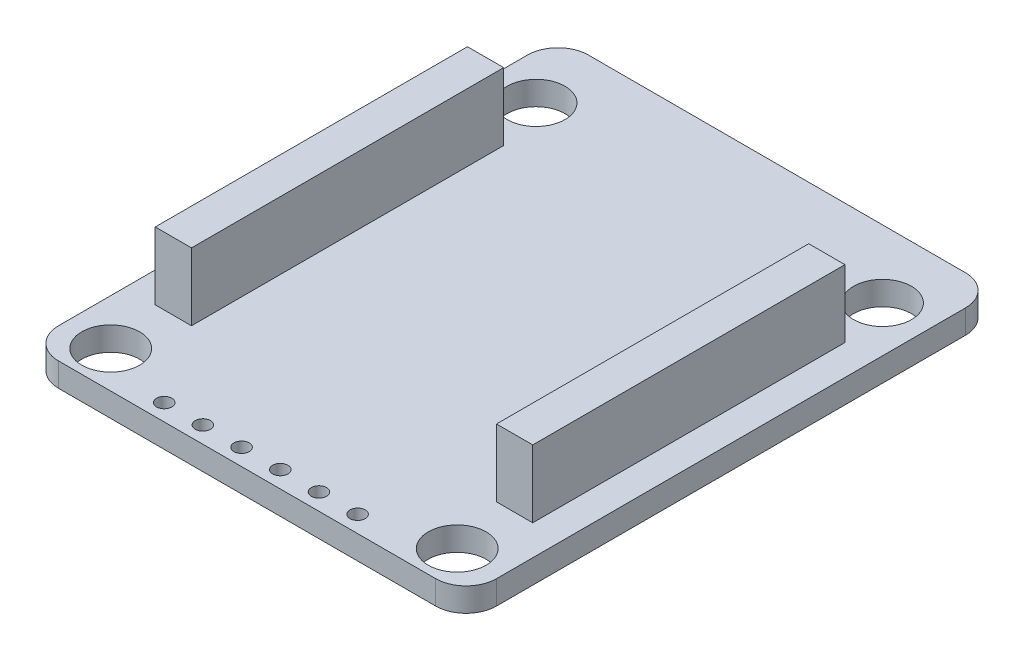
ISO-10303-21;
HEADER;
FILE_DESCRIPTION(('STEP AP214'),'2;1');
FILE_NAME('part.step','',(''),(''),'','','');
FILE_SCHEMA(('AUTOMOTIVE_DESIGN { 1 0 10303 214 1 1 1 1 }'));
ENDSEC;
DATA;
#1=APPLICATION_CONTEXT('core data for automotive mechanical design processes');
#2=APPLICATION_PROTOCOL_DEFINITION('international standard','automotive_design',2000,#1);
#3=PRODUCT_CONTEXT('',#1,'mechanical');
#4=PRODUCT('Part','Part','',(#3));
#5=PRODUCT_RELATED_PRODUCT_CATEGORY('part','',(#4));
#6=PRODUCT_DEFINITION_FORMATION('','',#4);
#7=PRODUCT_DEFINITION_CONTEXT('part definition',#1,'design');
#8=PRODUCT_DEFINITION('design','',#6,#7);
#9=PRODUCT_DEFINITION_SHAPE('','',#8);
#10=(LENGTH_UNIT() NAMED_UNIT(*) SI_UNIT(.MILLI.,.METRE.));
#11=(NAMED_UNIT(*) PLANE_ANGLE_UNIT() SI_UNIT($,.RADIAN.));
#12=(NAMED_UNIT(*) SI_UNIT($,.STERADIAN.) SOLID_ANGLE_UNIT());
#13=UNCERTAINTY_MEASURE_WITH_UNIT(LENGTH_MEASURE(1.E-05),#10,'distance_accuracy_value','');
#14=(GEOMETRIC_REPRESENTATION_CONTEXT(3) GLOBAL_UNCERTAINTY_ASSIGNED_CONTEXT((#13)) GLOBAL_UNIT_ASSIGNED_CONTEXT((#10,
#11,#12)) REPRESENTATION_CONTEXT('',''));
#15=CARTESIAN_POINT('',(0.,0.,0.));
#16=DIRECTION('',(0.,0.,1.));
#17=DIRECTION('',(1.,0.,0.));
#18=AXIS2_PLACEMENT_3D('',#15,#16,#17);
#19=CARTESIAN_POINT('',(0.,1.56,0.));
#20=DIRECTION('',(0.,-1.,0.));
#21=DIRECTION('',(0.,0.,-1.));
#22=AXIS2_PLACEMENT_3D('',#19,#20,#21);
#23=PLANE('',#22);
#24=DIRECTION('',(1.,0.,0.));
#25=VECTOR('',#24,1.);
#26=CARTESIAN_POINT('',(12.3934911778298,1.56,-9.46860091157884));
#27=LINE('',#26,#25);
#28=CARTESIAN_POINT('',(10.0134911778298,1.56,-9.46860091157884));
#29=VERTEX_POINT('',#28);
#30=CARTESIAN_POINT('',(12.3934911778298,1.56,-9.46860091157884));
#31=VERTEX_POINT('',#30);
#32=EDGE_CURVE('E186',#29,#31,#27,.T.);
#33=ORIENTED_EDGE('',*,*,#32,.T.);
#34=DIRECTION('',(0.,0.,1.));
#35=VECTOR('',#34,1.);
#36=CARTESIAN_POINT('',(12.3934911778298,1.56,-9.46860091157884));
#37=LINE('',#36,#35);
#38=CARTESIAN_POINT('',(12.3934911778298,1.56,11.0313990884212));
#39=VERTEX_POINT('',#38);
#40=EDGE_CURVE('E160',#31,#39,#37,.T.);
#41=ORIENTED_EDGE('',*,*,#40,.T.);
#42=DIRECTION('',(-1.,0.,0.));
#43=VECTOR('',#42,1.);
#44=CARTESIAN_POINT('',(12.3934911778298,1.56,11.0313990884212));
#45=LINE('',#44,#43);
#46=CARTESIAN_POINT('',(10.0134911778298,1.56,11.0313990884212));
#47=VERTEX_POINT('',#46);
#48=EDGE_CURVE('E176',#39,#47,#45,.T.);
#49=ORIENTED_EDGE('',*,*,#48,.T.);
#50=DIRECTION('',(0.,0.,-1.));
#51=VECTOR('',#50,1.);
#52=CARTESIAN_POINT('',(10.0134911778298,1.56,-9.46860091157884));
#53=LINE('',#52,#51);
#54=EDGE_CURVE('E188',#47,#29,#53,.T.);
#55=ORIENTED_EDGE('',*,*,#54,.T.);
#56=EDGE_LOOP('',(#33,#41,#49,#55));
#57=FACE_BOUND('',#56,.T.);
#58=CARTESIAN_POINT('',(-6.54127549884275,1.56,16.295));
#59=DIRECTION('',(0.,1.,0.));
#60=DIRECTION('',(0.,0.,1.));
#61=AXIS2_PLACEMENT_3D('',#58,#59,#60);
#62=CIRCLE('',#61,0.5);
#63=CARTESIAN_POINT('',(-6.54127549884275,1.56,16.795));
#64=VERTEX_POINT('',#63);
#65=EDGE_CURVE('E202',#64,#64,#62,.T.);
#66=ORIENTED_EDGE('',*,*,#65,.F.);
#67=EDGE_LOOP('',(#66));
#68=FACE_BOUND('',#67,.T.);
#69=CARTESIAN_POINT('',(-4.00127549884275,1.56,16.295));
#70=DIRECTION('',(0.,1.,0.));
#71=DIRECTION('',(0.,0.,1.));
#72=AXIS2_PLACEMENT_3D('',#69,#70,#71);
#73=CIRCLE('',#72,0.5);
#74=CARTESIAN_POINT('',(-4.00127549884275,1.56,16.795));
#75=VERTEX_POINT('',#74);
#76=EDGE_CURVE('E205',#75,#75,#73,.T.);
#77=ORIENTED_EDGE('',*,*,#76,.F.);
#78=EDGE_LOOP('',(#77));
#79=FACE_BOUND('',#78,.T.);
#80=CARTESIAN_POINT('',(-1.46127549884275,1.56,16.295));
#81=DIRECTION('',(0.,1.,0.));
#82=DIRECTION('',(0.,0.,1.));
#83=AXIS2_PLACEMENT_3D('',#80,#81,#82);
#84=CIRCLE('',#83,0.5);
#85=CARTESIAN_POINT('',(-1.46127549884275,1.56,16.795));
#86=VERTEX_POINT('',#85);
#87=EDGE_CURVE('E211',#86,#86,#84,.T.);
#88=ORIENTED_EDGE('',*,*,#87,.F.);
#89=EDGE_LOOP('',(#88));
#90=FACE_BOUND('',#89,.T.);
#91=CARTESIAN_POINT('',(1.07872450115725,1.56,16.295));
#92=DIRECTION('',(0.,1.,0.));
#93=DIRECTION('',(0.,0.,1.));
#94=AXIS2_PLACEMENT_3D('',#91,#92,#93);
#95=CIRCLE('',#94,0.5);
#96=CARTESIAN_POINT('',(1.07872450115725,1.56,16.795));
#97=VERTEX_POINT('',#96);
#98=EDGE_CURVE('E217',#97,#97,#95,.T.);
#99=ORIENTED_EDGE('',*,*,#98,.F.);
#100=EDGE_LOOP('',(#99));
#101=FACE_BOUND('',#100,.T.);
#102=CARTESIAN_POINT('',(3.61872450115725,1.56,16.295));
#103=DIRECTION('',(0.,1.,0.));
#104=DIRECTION('',(0.,0.,1.));
#105=AXIS2_PLACEMENT_3D('',#102,#103,#104);
#106=CIRCLE('',#105,0.5);
#107=CARTESIAN_POINT('',(3.61872450115725,1.56,16.795));
#108=VERTEX_POINT('',#107);
#109=EDGE_CURVE('E223',#108,#108,#106,.T.);
#110=ORIENTED_EDGE('',*,*,#109,.F.);
#111=EDGE_LOOP('',(#110));
#112=FACE_BOUND('',#111,.T.);
#113=CARTESIAN_POINT('',(6.15872450115724,1.56,16.295));
#114=DIRECTION('',(0.,1.,0.));
#115=DIRECTION('',(0.,0.,1.));
#116=AXIS2_PLACEMENT_3D('',#113,#114,#115);
#117=CIRCLE('',#116,0.500000000000001);
#118=CARTESIAN_POINT('',(6.15872450115724,1.56,16.795));
#119=VERTEX_POINT('',#118);
#120=EDGE_CURVE('E229',#119,#119,#117,.T.);
#121=ORIENTED_EDGE('',*,*,#120,.F.);
#122=EDGE_LOOP('',(#121));
#123=FACE_BOUND('',#122,.T.);
#124=DIRECTION('',(0.,0.,-1.));
#125=VECTOR('',#124,1.);
#126=CARTESIAN_POINT('',(14.38,1.56,17.395));
#127=LINE('',#126,#125);
#128=CARTESIAN_POINT('',(14.38,1.56,15.395));
#129=VERTEX_POINT('',#128);
#130=CARTESIAN_POINT('',(14.38,1.56,-15.395));
#131=VERTEX_POINT('',#130);
#132=EDGE_CURVE('E291',#129,#131,#127,.T.);
#133=ORIENTED_EDGE('',*,*,#132,.T.);
#134=CARTESIAN_POINT('',(12.38,1.56,-15.395));
#135=DIRECTION('',(0.,-1.,0.));
#136=DIRECTION('',(0.,0.,-1.));
#137=AXIS2_PLACEMENT_3D('',#134,#135,#136);
#138=CIRCLE('',#137,2.);
#139=CARTESIAN_POINT('',(12.38,1.56,-17.395));
#140=VERTEX_POINT('',#139);
#141=EDGE_CURVE('E334',#131,#140,#138,.F.);
#142=ORIENTED_EDGE('',*,*,#141,.T.);
#143=DIRECTION('',(-1.,0.,0.));
#144=VECTOR('',#143,1.);
#145=CARTESIAN_POINT('',(-14.38,1.56,-17.395));
#146=LINE('',#145,#144);
#147=CARTESIAN_POINT('',(-12.38,1.56,-17.395));
#148=VERTEX_POINT('',#147);
#149=EDGE_CURVE('E294',#140,#148,#146,.T.);
#150=ORIENTED_EDGE('',*,*,#149,.T.);
#151=CARTESIAN_POINT('',(-12.38,1.56,-15.395));
#152=DIRECTION('',(0.,-1.,0.));
#153=DIRECTION('',(0.,0.,-1.));
#154=AXIS2_PLACEMENT_3D('',#151,#152,#153);
#155=CIRCLE('',#154,2.);
#156=CARTESIAN_POINT('',(-14.38,1.56,-15.395));
#157=VERTEX_POINT('',#156);
#158=EDGE_CURVE('E329',#148,#157,#155,.F.);
#159=ORIENTED_EDGE('',*,*,#158,.T.);
#160=DIRECTION('',(0.,0.,1.));
#161=VECTOR('',#160,1.);
#162=CARTESIAN_POINT('',(-14.38,1.56,17.395));
#163=LINE('',#162,#161);
#164=CARTESIAN_POINT('',(-14.38,1.56,15.395));
#165=VERTEX_POINT('',#164);
#166=EDGE_CURVE('E298',#157,#165,#163,.T.);
#167=ORIENTED_EDGE('',*,*,#166,.T.);
#168=CARTESIAN_POINT('',(-12.38,1.56,15.395));
#169=DIRECTION('',(0.,-1.,0.));
#170=DIRECTION('',(0.,0.,-1.));
#171=AXIS2_PLACEMENT_3D('',#168,#169,#170);
#172=CIRCLE('',#171,2.);
#173=CARTESIAN_POINT('',(-12.38,1.56,17.395));
#174=VERTEX_POINT('',#173);
#175=EDGE_CURVE('E62',#165,#174,#172,.F.);
#176=ORIENTED_EDGE('',*,*,#175,.T.);
#177=DIRECTION('',(1.,0.,0.));
#178=VECTOR('',#177,1.);
#179=CARTESIAN_POINT('',(-14.38,1.56,17.395));
#180=LINE('',#179,#178);
#181=CARTESIAN_POINT('',(12.38,1.56,17.395));
#182=VERTEX_POINT('',#181);
#183=EDGE_CURVE('E300',#174,#182,#180,.T.);
#184=ORIENTED_EDGE('',*,*,#183,.T.);
#185=CARTESIAN_POINT('',(12.38,1.56,15.395));
#186=DIRECTION('',(0.,-1.,0.));
#187=DIRECTION('',(0.,0.,-1.));
#188=AXIS2_PLACEMENT_3D('',#185,#186,#187);
#189=CIRCLE('',#188,2.);
#190=EDGE_CURVE('E332',#182,#129,#189,.F.);
#191=ORIENTED_EDGE('',*,*,#190,.T.);
#192=EDGE_LOOP('',(#133,#142,#150,#159,#167,#176,#184,#191));
#193=FACE_BOUND('',#192,.T.);
#194=CARTESIAN_POINT('',(11.375,1.56,14.975));
#195=DIRECTION('',(0.,1.,0.));
#196=DIRECTION('',(0.,0.,1.));
#197=AXIS2_PLACEMENT_3D('',#194,#195,#196);
#198=CIRCLE('',#197,1.9);
#199=CARTESIAN_POINT('',(11.375,1.56,16.875));
#200=VERTEX_POINT('',#199);
#201=EDGE_CURVE('E284',#200,#200,#198,.T.);
#202=ORIENTED_EDGE('',*,*,#201,.F.);
#203=EDGE_LOOP('',(#202));
#204=FACE_BOUND('',#203,.T.);
#205=CARTESIAN_POINT('',(-11.375,1.56,14.975));
#206=DIRECTION('',(0.,1.,0.));
#207=DIRECTION('',(0.,0.,1.));
#208=AXIS2_PLACEMENT_3D('',#205,#206,#207);
#209=CIRCLE('',#208,1.9);
#210=CARTESIAN_POINT('',(-11.375,1.56,16.875));
#211=VERTEX_POINT('',#210);
#212=EDGE_CURVE('E278',#211,#211,#209,.T.);
#213=ORIENTED_EDGE('',*,*,#212,.F.);
#214=EDGE_LOOP('',(#213));
#215=FACE_BOUND('',#214,.T.);
#216=CARTESIAN_POINT('',(11.375,1.56,-12.955));
#217=DIRECTION('',(0.,1.,0.));
#218=DIRECTION('',(0.,0.,1.));
#219=AXIS2_PLACEMENT_3D('',#216,#217,#218);
#220=CIRCLE('',#219,1.9);
#221=CARTESIAN_POINT('',(11.375,1.56,-11.055));
#222=VERTEX_POINT('',#221);
#223=EDGE_CURVE('E272',#222,#222,#220,.T.);
#224=ORIENTED_EDGE('',*,*,#223,.F.);
#225=EDGE_LOOP('',(#224));
#226=FACE_BOUND('',#225,.T.);
#227=CARTESIAN_POINT('',(-11.375,1.56,-12.955));
#228=DIRECTION('',(0.,1.,0.));
#229=DIRECTION('',(0.,0.,1.));
#230=AXIS2_PLACEMENT_3D('',#227,#228,#229);
#231=CIRCLE('',#230,1.9);
#232=CARTESIAN_POINT('',(-11.375,1.56,-11.055));
#233=VERTEX_POINT('',#232);
#234=EDGE_CURVE('E266',#233,#233,#231,.T.);
#235=ORIENTED_EDGE('',*,*,#234,.F.);
#236=EDGE_LOOP('',(#235));
#237=FACE_BOUND('',#236,.T.);
#238=DIRECTION('',(0.,0.,1.));
#239=VECTOR('',#238,1.);
#240=CARTESIAN_POINT('',(-12.3934911778298,1.56,-9.46860091157884));
#241=LINE('',#240,#239);
#242=CARTESIAN_POINT('',(-12.3934911778298,1.56,-9.46860091157884));
#243=VERTEX_POINT('',#242);
#244=CARTESIAN_POINT('',(-12.3934911778298,1.56,11.0313990884212));
#245=VERTEX_POINT('',#244);
#246=EDGE_CURVE('E201',#243,#245,#241,.T.);
#247=ORIENTED_EDGE('',*,*,#246,.F.);
#248=DIRECTION('',(-1.,0.,0.));
#249=VECTOR('',#248,1.);
#250=CARTESIAN_POINT('',(-12.3934911778298,1.56,-9.46860091157884));
#251=LINE('',#250,#249);
#252=CARTESIAN_POINT('',(-10.0134911778298,1.56,-9.46860091157884));
#253=VERTEX_POINT('',#252);
#254=EDGE_CURVE('E238',#253,#243,#251,.T.);
#255=ORIENTED_EDGE('',*,*,#254,.F.);
#256=DIRECTION('',(0.,0.,-1.));
#257=VECTOR('',#256,1.);
#258=CARTESIAN_POINT('',(-10.0134911778298,1.56,-9.46860091157884));
#259=LINE('',#258,#257);
#260=CARTESIAN_POINT('',(-10.0134911778298,1.56,11.0313990884212));
#261=VERTEX_POINT('',#260);
#262=EDGE_CURVE('E250',#261,#253,#259,.T.);
#263=ORIENTED_EDGE('',*,*,#262,.F.);
#264=DIRECTION('',(1.,0.,0.));
#265=VECTOR('',#264,1.);
#266=CARTESIAN_POINT('',(-12.3934911778298,1.56,11.0313990884212));
#267=LINE('',#266,#265);
#268=EDGE_CURVE('E247',#245,#261,#267,.T.);
#269=ORIENTED_EDGE('',*,*,#268,.F.);
#270=EDGE_LOOP('',(#247,#255,#263,#269));
#271=FACE_BOUND('',#270,.T.);
#272=ADVANCED_FACE('F40',(#57,#68,#79,#90,#101,#112,#123,#193,#204,#215,#226,#237,#271),#23,.F.);
#273=CARTESIAN_POINT('',(14.38,1.56,17.395));
#274=DIRECTION('',(-1.,0.,0.));
#275=DIRECTION('',(0.,0.,1.));
#276=AXIS2_PLACEMENT_3D('',#273,#274,#275);
#277=PLANE('',#276);
#278=DIRECTION('',(0.,0.,-1.));
#279=VECTOR('',#278,1.);
#280=CARTESIAN_POINT('',(14.38,0.,17.395));
#281=LINE('',#280,#279);
#282=CARTESIAN_POINT('',(14.38,0.,15.395));
#283=VERTEX_POINT('',#282);
#284=CARTESIAN_POINT('',(14.38,0.,-15.395));
#285=VERTEX_POINT('',#284);
#286=EDGE_CURVE('E290',#283,#285,#281,.T.);
#287=ORIENTED_EDGE('',*,*,#286,.T.);
#288=DIRECTION('',(0.,-1.,0.));
#289=VECTOR('',#288,1.);
#290=CARTESIAN_POINT('',(14.38,1.56,-15.395));
#291=LINE('',#290,#289);
#292=EDGE_CURVE('E327',#285,#131,#291,.F.);
#293=ORIENTED_EDGE('',*,*,#292,.T.);
#294=ORIENTED_EDGE('',*,*,#132,.F.);
#295=DIRECTION('',(0.,-1.,0.));
#296=VECTOR('',#295,1.);
#297=CARTESIAN_POINT('',(14.38,1.56,15.395));
#298=LINE('',#297,#296);
#299=EDGE_CURVE('E324',#129,#283,#298,.T.);
#300=ORIENTED_EDGE('',*,*,#299,.T.);
#301=EDGE_LOOP('',(#287,#293,#294,#300));
#302=FACE_BOUND('',#301,.T.);
#303=ADVANCED_FACE('F364',(#302),#277,.F.);
#304=CARTESIAN_POINT('',(-14.38,1.56,-17.395));
#305=DIRECTION('',(0.,0.,1.));
#306=DIRECTION('',(1.,0.,0.));
#307=AXIS2_PLACEMENT_3D('',#304,#305,#306);
#308=PLANE('',#307);
#309=ORIENTED_EDGE('',*,*,#149,.F.);
#310=DIRECTION('',(0.,-1.,0.));
#311=VECTOR('',#310,1.);
#312=CARTESIAN_POINT('',(12.38,1.56,-17.395));
#313=LINE('',#312,#311);
#314=CARTESIAN_POINT('',(12.38,0.,-17.395));
#315=VERTEX_POINT('',#314);
#316=EDGE_CURVE('E313',#140,#315,#313,.T.);
#317=ORIENTED_EDGE('',*,*,#316,.T.);
#318=DIRECTION('',(-1.,0.,0.));
#319=VECTOR('',#318,1.);
#320=CARTESIAN_POINT('',(-14.38,0.,-17.395));
#321=LINE('',#320,#319);
#322=CARTESIAN_POINT('',(-12.38,0.,-17.395));
#323=VERTEX_POINT('',#322);
#324=EDGE_CURVE('E305',#315,#323,#321,.T.);
#325=ORIENTED_EDGE('',*,*,#324,.T.);
#326=DIRECTION('',(0.,-1.,0.));
#327=VECTOR('',#326,1.);
#328=CARTESIAN_POINT('',(-12.38,1.56,-17.395));
#329=LINE('',#328,#327);
#330=EDGE_CURVE('E302',#323,#148,#329,.F.);
#331=ORIENTED_EDGE('',*,*,#330,.T.);
#332=EDGE_LOOP('',(#309,#317,#325,#331));
#333=FACE_BOUND('',#332,.T.);
#334=ADVANCED_FACE('F372',(#333),#308,.F.);
#335=CARTESIAN_POINT('',(-14.38,1.56,17.395));
#336=DIRECTION('',(1.,0.,0.));
#337=DIRECTION('',(0.,0.,-1.));
#338=AXIS2_PLACEMENT_3D('',#335,#336,#337);
#339=PLANE('',#338);
#340=DIRECTION('',(0.,0.,1.));
#341=VECTOR('',#340,1.);
#342=CARTESIAN_POINT('',(-14.38,0.,17.395));
#343=LINE('',#342,#341);
#344=CARTESIAN_POINT('',(-14.38,0.,-15.395));
#345=VERTEX_POINT('',#344);
#346=CARTESIAN_POINT('',(-14.38,0.,15.395));
#347=VERTEX_POINT('',#346);
#348=EDGE_CURVE('E308',#345,#347,#343,.T.);
#349=ORIENTED_EDGE('',*,*,#348,.T.);
#350=DIRECTION('',(0.,-1.,0.));
#351=VECTOR('',#350,1.);
#352=CARTESIAN_POINT('',(-14.38,1.56,15.395));
#353=LINE('',#352,#351);
#354=EDGE_CURVE('E11',#347,#165,#353,.F.);
#355=ORIENTED_EDGE('',*,*,#354,.T.);
#356=ORIENTED_EDGE('',*,*,#166,.F.);
#357=DIRECTION('',(0.,-1.,0.));
#358=VECTOR('',#357,1.);
#359=CARTESIAN_POINT('',(-14.38,1.56,-15.395));
#360=LINE('',#359,#358);
#361=EDGE_CURVE('E48',#157,#345,#360,.T.);
#362=ORIENTED_EDGE('',*,*,#361,.T.);
#363=EDGE_LOOP('',(#349,#355,#356,#362));
#364=FACE_BOUND('',#363,.T.);
#365=ADVANCED_FACE('F344',(#364),#339,.F.);
#366=CARTESIAN_POINT('',(-14.38,1.56,17.395));
#367=DIRECTION('',(0.,0.,-1.));
#368=DIRECTION('',(-1.,0.,0.));
#369=AXIS2_PLACEMENT_3D('',#366,#367,#368);
#370=PLANE('',#369);
#371=DIRECTION('',(1.,0.,0.));
#372=VECTOR('',#371,1.);
#373=CARTESIAN_POINT('',(-14.38,0.,17.395));
#374=LINE('',#373,#372);
#375=CARTESIAN_POINT('',(-12.38,0.,17.395));
#376=VERTEX_POINT('',#375);
#377=CARTESIAN_POINT('',(12.38,0.,17.395));
#378=VERTEX_POINT('',#377);
#379=EDGE_CURVE('E295',#376,#378,#374,.T.);
#380=ORIENTED_EDGE('',*,*,#379,.T.);
#381=DIRECTION('',(0.,-1.,0.));
#382=VECTOR('',#381,1.);
#383=CARTESIAN_POINT('',(12.38,1.56,17.395));
#384=LINE('',#383,#382);
#385=EDGE_CURVE('E55',#378,#182,#384,.F.);
#386=ORIENTED_EDGE('',*,*,#385,.T.);
#387=ORIENTED_EDGE('',*,*,#183,.F.);
#388=DIRECTION('',(0.,-1.,0.));
#389=VECTOR('',#388,1.);
#390=CARTESIAN_POINT('',(-12.38,1.56,17.395));
#391=LINE('',#390,#389);
#392=EDGE_CURVE('E336',#174,#376,#391,.T.);
#393=ORIENTED_EDGE('',*,*,#392,.T.);
#394=EDGE_LOOP('',(#380,#386,#387,#393));
#395=FACE_BOUND('',#394,.T.);
#396=ADVANCED_FACE('F355',(#395),#370,.F.);
#397=CARTESIAN_POINT('',(0.,0.,0.));
#398=DIRECTION('',(0.,-1.,0.));
#399=DIRECTION('',(0.,0.,-1.));
#400=AXIS2_PLACEMENT_3D('',#397,#398,#399);
#401=PLANE('',#400);
#402=CARTESIAN_POINT('',(-6.54127549884275,0.,16.295));
#403=DIRECTION('',(0.,1.,0.));
#404=DIRECTION('',(0.,0.,1.));
#405=AXIS2_PLACEMENT_3D('',#402,#403,#404);
#406=CIRCLE('',#405,0.5);
#407=CARTESIAN_POINT('',(-6.54127549884275,0.,16.795));
#408=VERTEX_POINT('',#407);
#409=EDGE_CURVE('E198',#408,#408,#406,.T.);
#410=ORIENTED_EDGE('',*,*,#409,.T.);
#411=EDGE_LOOP('',(#410));
#412=FACE_BOUND('',#411,.T.);
#413=CARTESIAN_POINT('',(-4.00127549884275,0.,16.295));
#414=DIRECTION('',(0.,1.,0.));
#415=DIRECTION('',(0.,0.,1.));
#416=AXIS2_PLACEMENT_3D('',#413,#414,#415);
#417=CIRCLE('',#416,0.5);
#418=CARTESIAN_POINT('',(-4.00127549884275,0.,16.795));
#419=VERTEX_POINT('',#418);
#420=EDGE_CURVE('E208',#419,#419,#417,.T.);
#421=ORIENTED_EDGE('',*,*,#420,.T.);
#422=EDGE_LOOP('',(#421));
#423=FACE_BOUND('',#422,.T.);
#424=CARTESIAN_POINT('',(-1.46127549884275,0.,16.295));
#425=DIRECTION('',(0.,1.,0.));
#426=DIRECTION('',(0.,0.,1.));
#427=AXIS2_PLACEMENT_3D('',#424,#425,#426);
#428=CIRCLE('',#427,0.5);
#429=CARTESIAN_POINT('',(-1.46127549884275,0.,16.795));
#430=VERTEX_POINT('',#429);
#431=EDGE_CURVE('E214',#430,#430,#428,.T.);
#432=ORIENTED_EDGE('',*,*,#431,.T.);
#433=EDGE_LOOP('',(#432));
#434=FACE_BOUND('',#433,.T.);
#435=CARTESIAN_POINT('',(1.07872450115725,0.,16.295));
#436=DIRECTION('',(0.,1.,0.));
#437=DIRECTION('',(0.,0.,1.));
#438=AXIS2_PLACEMENT_3D('',#435,#436,#437);
#439=CIRCLE('',#438,0.5);
#440=CARTESIAN_POINT('',(1.07872450115725,0.,16.795));
#441=VERTEX_POINT('',#440);
#442=EDGE_CURVE('E220',#441,#441,#439,.T.);
#443=ORIENTED_EDGE('',*,*,#442,.T.);
#444=EDGE_LOOP('',(#443));
#445=FACE_BOUND('',#444,.T.);
#446=CARTESIAN_POINT('',(3.61872450115725,0.,16.295));
#447=DIRECTION('',(0.,1.,0.));
#448=DIRECTION('',(0.,0.,1.));
#449=AXIS2_PLACEMENT_3D('',#446,#447,#448);
#450=CIRCLE('',#449,0.5);
#451=CARTESIAN_POINT('',(3.61872450115725,0.,16.795));
#452=VERTEX_POINT('',#451);
#453=EDGE_CURVE('E226',#452,#452,#450,.T.);
#454=ORIENTED_EDGE('',*,*,#453,.T.);
#455=EDGE_LOOP('',(#454));
#456=FACE_BOUND('',#455,.T.);
#457=CARTESIAN_POINT('',(6.15872450115724,0.,16.295));
#458=DIRECTION('',(0.,1.,0.));
#459=DIRECTION('',(0.,0.,1.));
#460=AXIS2_PLACEMENT_3D('',#457,#458,#459);
#461=CIRCLE('',#460,0.500000000000001);
#462=CARTESIAN_POINT('',(6.15872450115724,0.,16.795));
#463=VERTEX_POINT('',#462);
#464=EDGE_CURVE('E165',#463,#463,#461,.T.);
#465=ORIENTED_EDGE('',*,*,#464,.T.);
#466=EDGE_LOOP('',(#465));
#467=FACE_BOUND('',#466,.T.);
#468=CARTESIAN_POINT('',(-11.375,0.,-12.955));
#469=DIRECTION('',(0.,1.,0.));
#470=DIRECTION('',(0.,0.,1.));
#471=AXIS2_PLACEMENT_3D('',#468,#469,#470);
#472=CIRCLE('',#471,1.9);
#473=CARTESIAN_POINT('',(-11.375,0.,-11.055));
#474=VERTEX_POINT('',#473);
#475=EDGE_CURVE('E269',#474,#474,#472,.T.);
#476=ORIENTED_EDGE('',*,*,#475,.T.);
#477=EDGE_LOOP('',(#476));
#478=FACE_BOUND('',#477,.T.);
#479=CARTESIAN_POINT('',(11.375,0.,-12.955));
#480=DIRECTION('',(0.,1.,0.));
#481=DIRECTION('',(0.,0.,1.));
#482=AXIS2_PLACEMENT_3D('',#479,#480,#481);
#483=CIRCLE('',#482,1.9);
#484=CARTESIAN_POINT('',(11.375,0.,-11.055));
#485=VERTEX_POINT('',#484);
#486=EDGE_CURVE('E275',#485,#485,#483,.T.);
#487=ORIENTED_EDGE('',*,*,#486,.T.);
#488=EDGE_LOOP('',(#487));
#489=FACE_BOUND('',#488,.T.);
#490=CARTESIAN_POINT('',(-11.375,0.,14.975));
#491=DIRECTION('',(0.,1.,0.));
#492=DIRECTION('',(0.,0.,1.));
#493=AXIS2_PLACEMENT_3D('',#490,#491,#492);
#494=CIRCLE('',#493,1.9);
#495=CARTESIAN_POINT('',(-11.375,0.,16.875));
#496=VERTEX_POINT('',#495);
#497=EDGE_CURVE('E281',#496,#496,#494,.T.);
#498=ORIENTED_EDGE('',*,*,#497,.T.);
#499=EDGE_LOOP('',(#498));
#500=FACE_BOUND('',#499,.T.);
#501=CARTESIAN_POINT('',(11.375,0.,14.975));
#502=DIRECTION('',(0.,1.,0.));
#503=DIRECTION('',(0.,0.,1.));
#504=AXIS2_PLACEMENT_3D('',#501,#502,#503);
#505=CIRCLE('',#504,1.9);
#506=CARTESIAN_POINT('',(11.375,0.,16.875));
#507=VERTEX_POINT('',#506);
#508=EDGE_CURVE('E287',#507,#507,#505,.T.);
#509=ORIENTED_EDGE('',*,*,#508,.T.);
#510=EDGE_LOOP('',(#509));
#511=FACE_BOUND('',#510,.T.);
#512=ORIENTED_EDGE('',*,*,#324,.F.);
#513=CARTESIAN_POINT('',(12.38,0.,-15.395));
#514=DIRECTION('',(0.,-1.,0.));
#515=DIRECTION('',(0.,0.,-1.));
#516=AXIS2_PLACEMENT_3D('',#513,#514,#515);
#517=CIRCLE('',#516,2.);
#518=EDGE_CURVE('E322',#315,#285,#517,.T.);
#519=ORIENTED_EDGE('',*,*,#518,.T.);
#520=ORIENTED_EDGE('',*,*,#286,.F.);
#521=CARTESIAN_POINT('',(12.38,0.,15.395));
#522=DIRECTION('',(0.,-1.,0.));
#523=DIRECTION('',(0.,0.,-1.));
#524=AXIS2_PLACEMENT_3D('',#521,#522,#523);
#525=CIRCLE('',#524,2.);
#526=EDGE_CURVE('E320',#283,#378,#525,.T.);
#527=ORIENTED_EDGE('',*,*,#526,.T.);
#528=ORIENTED_EDGE('',*,*,#379,.F.);
#529=CARTESIAN_POINT('',(-12.38,0.,15.395));
#530=DIRECTION('',(0.,-1.,0.));
#531=DIRECTION('',(0.,0.,-1.));
#532=AXIS2_PLACEMENT_3D('',#529,#530,#531);
#533=CIRCLE('',#532,2.);
#534=EDGE_CURVE('E318',#376,#347,#533,.T.);
#535=ORIENTED_EDGE('',*,*,#534,.T.);
#536=ORIENTED_EDGE('',*,*,#348,.F.);
#537=CARTESIAN_POINT('',(-12.38,0.,-15.395));
#538=DIRECTION('',(0.,-1.,0.));
#539=DIRECTION('',(0.,0.,-1.));
#540=AXIS2_PLACEMENT_3D('',#537,#538,#539);
#541=CIRCLE('',#540,2.);
#542=EDGE_CURVE('E316',#345,#323,#541,.T.);
#543=ORIENTED_EDGE('',*,*,#542,.T.);
#544=EDGE_LOOP('',(#512,#519,#520,#527,#528,#535,#536,#543));
#545=FACE_BOUND('',#544,.T.);
#546=ADVANCED_FACE('F350',(#412,#423,#434,#445,#456,#467,#478,#489,#500,#511,#545),#401,.T.);
#547=CARTESIAN_POINT('',(11.375,1.56,14.975));
#548=DIRECTION('',(0.,1.,0.));
#549=DIRECTION('',(0.,0.,1.));
#550=AXIS2_PLACEMENT_3D('',#547,#548,#549);
#551=CYLINDRICAL_SURFACE('',#550,1.9);
#552=ORIENTED_EDGE('',*,*,#508,.F.);
#553=EDGE_LOOP('',(#552));
#554=FACE_BOUND('',#553,.T.);
#555=ORIENTED_EDGE('',*,*,#201,.T.);
#556=EDGE_LOOP('',(#555));
#557=FACE_BOUND('',#556,.T.);
#558=ADVANCED_FACE('F388',(#554,#557),#551,.F.);
#559=CARTESIAN_POINT('',(-11.375,1.56,14.975));
#560=DIRECTION('',(0.,1.,0.));
#561=DIRECTION('',(0.,0.,1.));
#562=AXIS2_PLACEMENT_3D('',#559,#560,#561);
#563=CYLINDRICAL_SURFACE('',#562,1.9);
#564=ORIENTED_EDGE('',*,*,#497,.F.);
#565=EDGE_LOOP('',(#564));
#566=FACE_BOUND('',#565,.T.);
#567=ORIENTED_EDGE('',*,*,#212,.T.);
#568=EDGE_LOOP('',(#567));
#569=FACE_BOUND('',#568,.T.);
#570=ADVANCED_FACE('F608',(#566,#569),#563,.F.);
#571=CARTESIAN_POINT('',(11.375,1.56,-12.955));
#572=DIRECTION('',(0.,1.,0.));
#573=DIRECTION('',(0.,0.,1.));
#574=AXIS2_PLACEMENT_3D('',#571,#572,#573);
#575=CYLINDRICAL_SURFACE('',#574,1.9);
#576=ORIENTED_EDGE('',*,*,#486,.F.);
#577=EDGE_LOOP('',(#576));
#578=FACE_BOUND('',#577,.T.);
#579=ORIENTED_EDGE('',*,*,#223,.T.);
#580=EDGE_LOOP('',(#579));
#581=FACE_BOUND('',#580,.T.);
#582=ADVANCED_FACE('F598',(#578,#581),#575,.F.);
#583=CARTESIAN_POINT('',(-11.375,1.56,-12.955));
#584=DIRECTION('',(0.,1.,0.));
#585=DIRECTION('',(0.,0.,1.));
#586=AXIS2_PLACEMENT_3D('',#583,#584,#585);
#587=CYLINDRICAL_SURFACE('',#586,1.9);
#588=ORIENTED_EDGE('',*,*,#475,.F.);
#589=EDGE_LOOP('',(#588));
#590=FACE_BOUND('',#589,.T.);
#591=ORIENTED_EDGE('',*,*,#234,.T.);
#592=EDGE_LOOP('',(#591));
#593=FACE_BOUND('',#592,.T.);
#594=ADVANCED_FACE('F581',(#590,#593),#587,.F.);
#595=CARTESIAN_POINT('',(-12.3934911778298,5.99,-9.46860091157884));
#596=DIRECTION('',(1.,0.,0.));
#597=DIRECTION('',(0.,0.,-1.));
#598=AXIS2_PLACEMENT_3D('',#595,#596,#597);
#599=PLANE('',#598);
#600=ORIENTED_EDGE('',*,*,#246,.T.);
#601=DIRECTION('',(0.,-1.,0.));
#602=VECTOR('',#601,1.);
#603=CARTESIAN_POINT('',(-12.3934911778298,5.99,11.0313990884212));
#604=LINE('',#603,#602);
#605=CARTESIAN_POINT('',(-12.3934911778298,5.99,11.0313990884212));
#606=VERTEX_POINT('',#605);
#607=EDGE_CURVE('E263',#606,#245,#604,.T.);
#608=ORIENTED_EDGE('',*,*,#607,.F.);
#609=DIRECTION('',(0.,0.,1.));
#610=VECTOR('',#609,1.);
#611=CARTESIAN_POINT('',(-12.3934911778298,5.99,-9.46860091157884));
#612=LINE('',#611,#610);
#613=CARTESIAN_POINT('',(-12.3934911778298,5.99,-9.46860091157884));
#614=VERTEX_POINT('',#613);
#615=EDGE_CURVE('E234',#614,#606,#612,.T.);
#616=ORIENTED_EDGE('',*,*,#615,.F.);
#617=DIRECTION('',(0.,-1.,0.));
#618=VECTOR('',#617,1.);
#619=CARTESIAN_POINT('',(-12.3934911778298,5.99,-9.46860091157884));
#620=LINE('',#619,#618);
#621=EDGE_CURVE('E244',#614,#243,#620,.T.);
#622=ORIENTED_EDGE('',*,*,#621,.T.);
#623=EDGE_LOOP('',(#600,#608,#616,#622));
#624=FACE_BOUND('',#623,.T.);
#625=ADVANCED_FACE('F571',(#624),#599,.F.);
#626=CARTESIAN_POINT('',(-12.3934911778298,5.99,11.0313990884212));
#627=DIRECTION('',(0.,0.,-1.));
#628=DIRECTION('',(-1.,0.,0.));
#629=AXIS2_PLACEMENT_3D('',#626,#627,#628);
#630=PLANE('',#629);
#631=ORIENTED_EDGE('',*,*,#268,.T.);
#632=DIRECTION('',(0.,-1.,0.));
#633=VECTOR('',#632,1.);
#634=CARTESIAN_POINT('',(-10.0134911778298,5.99,11.0313990884212));
#635=LINE('',#634,#633);
#636=CARTESIAN_POINT('',(-10.0134911778298,5.99,11.0313990884212));
#637=VERTEX_POINT('',#636);
#638=EDGE_CURVE('E260',#637,#261,#635,.T.);
#639=ORIENTED_EDGE('',*,*,#638,.F.);
#640=DIRECTION('',(1.,0.,0.));
#641=VECTOR('',#640,1.);
#642=CARTESIAN_POINT('',(-12.3934911778298,5.99,11.0313990884212));
#643=LINE('',#642,#641);
#644=EDGE_CURVE('E237',#606,#637,#643,.T.);
#645=ORIENTED_EDGE('',*,*,#644,.F.);
#646=ORIENTED_EDGE('',*,*,#607,.T.);
#647=EDGE_LOOP('',(#631,#639,#645,#646));
#648=FACE_BOUND('',#647,.T.);
#649=ADVANCED_FACE('F561',(#648),#630,.F.);
#650=CARTESIAN_POINT('',(-10.0134911778298,5.99,-9.46860091157884));
#651=DIRECTION('',(-1.,0.,0.));
#652=DIRECTION('',(0.,0.,1.));
#653=AXIS2_PLACEMENT_3D('',#650,#651,#652);
#654=PLANE('',#653);
#655=ORIENTED_EDGE('',*,*,#262,.T.);
#656=DIRECTION('',(0.,-1.,0.));
#657=VECTOR('',#656,1.);
#658=CARTESIAN_POINT('',(-10.0134911778298,5.99,-9.46860091157884));
#659=LINE('',#658,#657);
#660=CARTESIAN_POINT('',(-10.0134911778298,5.99,-9.46860091157884));
#661=VERTEX_POINT('',#660);
#662=EDGE_CURVE('E257',#661,#253,#659,.T.);
#663=ORIENTED_EDGE('',*,*,#662,.F.);
#664=DIRECTION('',(0.,0.,-1.));
#665=VECTOR('',#664,1.);
#666=CARTESIAN_POINT('',(-10.0134911778298,5.99,-9.46860091157884));
#667=LINE('',#666,#665);
#668=EDGE_CURVE('E240',#637,#661,#667,.T.);
#669=ORIENTED_EDGE('',*,*,#668,.F.);
#670=ORIENTED_EDGE('',*,*,#638,.T.);
#671=EDGE_LOOP('',(#655,#663,#669,#670));
#672=FACE_BOUND('',#671,.T.);
#673=ADVANCED_FACE('F551',(#672),#654,.F.);
#674=CARTESIAN_POINT('',(-12.3934911778298,5.99,-9.46860091157884));
#675=DIRECTION('',(0.,0.,1.));
#676=DIRECTION('',(1.,0.,0.));
#677=AXIS2_PLACEMENT_3D('',#674,#675,#676);
#678=PLANE('',#677);
#679=ORIENTED_EDGE('',*,*,#254,.T.);
#680=ORIENTED_EDGE('',*,*,#621,.F.);
#681=DIRECTION('',(-1.,0.,0.));
#682=VECTOR('',#681,1.);
#683=CARTESIAN_POINT('',(-12.3934911778298,5.99,-9.46860091157884));
#684=LINE('',#683,#682);
#685=EDGE_CURVE('E242',#661,#614,#684,.T.);
#686=ORIENTED_EDGE('',*,*,#685,.F.);
#687=ORIENTED_EDGE('',*,*,#662,.T.);
#688=EDGE_LOOP('',(#679,#680,#686,#687));
#689=FACE_BOUND('',#688,.T.);
#690=ADVANCED_FACE('F541',(#689),#678,.F.);
#691=CARTESIAN_POINT('',(0.,5.99,0.));
#692=DIRECTION('',(0.,1.,0.));
#693=DIRECTION('',(0.,0.,1.));
#694=AXIS2_PLACEMENT_3D('',#691,#692,#693);
#695=PLANE('',#694);
#696=ORIENTED_EDGE('',*,*,#615,.T.);
#697=ORIENTED_EDGE('',*,*,#644,.T.);
#698=ORIENTED_EDGE('',*,*,#668,.T.);
#699=ORIENTED_EDGE('',*,*,#685,.T.);
#700=EDGE_LOOP('',(#696,#697,#698,#699));
#701=FACE_BOUND('',#700,.T.);
#702=ADVANCED_FACE('F531',(#701),#695,.T.);
#703=CARTESIAN_POINT('',(6.15872450115724,0.,16.295));
#704=DIRECTION('',(0.,1.,0.));
#705=DIRECTION('',(0.,0.,1.));
#706=AXIS2_PLACEMENT_3D('',#703,#704,#705);
#707=CYLINDRICAL_SURFACE('',#706,0.500000000000001);
#708=ORIENTED_EDGE('',*,*,#464,.F.);
#709=EDGE_LOOP('',(#708));
#710=FACE_BOUND('',#709,.T.);
#711=ORIENTED_EDGE('',*,*,#120,.T.);
#712=EDGE_LOOP('',(#711));
#713=FACE_BOUND('',#712,.T.);
#714=ADVANCED_FACE('F521',(#710,#713),#707,.F.);
#715=CARTESIAN_POINT('',(3.61872450115725,0.,16.295));
#716=DIRECTION('',(0.,1.,0.));
#717=DIRECTION('',(0.,0.,1.));
#718=AXIS2_PLACEMENT_3D('',#715,#716,#717);
#719=CYLINDRICAL_SURFACE('',#718,0.5);
#720=ORIENTED_EDGE('',*,*,#453,.F.);
#721=EDGE_LOOP('',(#720));
#722=FACE_BOUND('',#721,.T.);
#723=ORIENTED_EDGE('',*,*,#109,.T.);
#724=EDGE_LOOP('',(#723));
#725=FACE_BOUND('',#724,.T.);
#726=ADVANCED_FACE('F511',(#722,#725),#719,.F.);
#727=CARTESIAN_POINT('',(1.07872450115725,0.,16.295));
#728=DIRECTION('',(0.,1.,0.));
#729=DIRECTION('',(0.,0.,1.));
#730=AXIS2_PLACEMENT_3D('',#727,#728,#729);
#731=CYLINDRICAL_SURFACE('',#730,0.5);
#732=ORIENTED_EDGE('',*,*,#442,.F.);
#733=EDGE_LOOP('',(#732));
#734=FACE_BOUND('',#733,.T.);
#735=ORIENTED_EDGE('',*,*,#98,.T.);
#736=EDGE_LOOP('',(#735));
#737=FACE_BOUND('',#736,.T.);
#738=ADVANCED_FACE('F501',(#734,#737),#731,.F.);
#739=CARTESIAN_POINT('',(-1.46127549884275,0.,16.295));
#740=DIRECTION('',(0.,1.,0.));
#741=DIRECTION('',(0.,0.,1.));
#742=AXIS2_PLACEMENT_3D('',#739,#740,#741);
#743=CYLINDRICAL_SURFACE('',#742,0.5);
#744=ORIENTED_EDGE('',*,*,#431,.F.);
#745=EDGE_LOOP('',(#744));
#746=FACE_BOUND('',#745,.T.);
#747=ORIENTED_EDGE('',*,*,#87,.T.);
#748=EDGE_LOOP('',(#747));
#749=FACE_BOUND('',#748,.T.);
#750=ADVANCED_FACE('F491',(#746,#749),#743,.F.);
#751=CARTESIAN_POINT('',(-4.00127549884275,0.,16.295));
#752=DIRECTION('',(0.,1.,0.));
#753=DIRECTION('',(0.,0.,1.));
#754=AXIS2_PLACEMENT_3D('',#751,#752,#753);
#755=CYLINDRICAL_SURFACE('',#754,0.5);
#756=ORIENTED_EDGE('',*,*,#420,.F.);
#757=EDGE_LOOP('',(#756));
#758=FACE_BOUND('',#757,.T.);
#759=ORIENTED_EDGE('',*,*,#76,.T.);
#760=EDGE_LOOP('',(#759));
#761=FACE_BOUND('',#760,.T.);
#762=ADVANCED_FACE('F481',(#758,#761),#755,.F.);
#763=CARTESIAN_POINT('',(-6.54127549884275,0.,16.295));
#764=DIRECTION('',(0.,1.,0.));
#765=DIRECTION('',(0.,0.,1.));
#766=AXIS2_PLACEMENT_3D('',#763,#764,#765);
#767=CYLINDRICAL_SURFACE('',#766,0.5);
#768=ORIENTED_EDGE('',*,*,#409,.F.);
#769=EDGE_LOOP('',(#768));
#770=FACE_BOUND('',#769,.T.);
#771=ORIENTED_EDGE('',*,*,#65,.T.);
#772=EDGE_LOOP('',(#771));
#773=FACE_BOUND('',#772,.T.);
#774=ADVANCED_FACE('F472',(#770,#773),#767,.F.);
#775=CARTESIAN_POINT('',(12.3934911778298,5.99,-9.46860091157884));
#776=DIRECTION('',(1.,0.,0.));
#777=DIRECTION('',(0.,0.,-1.));
#778=AXIS2_PLACEMENT_3D('',#775,#776,#777);
#779=PLANE('',#778);
#780=ORIENTED_EDGE('',*,*,#40,.F.);
#781=DIRECTION('',(0.,-1.,0.));
#782=VECTOR('',#781,1.);
#783=CARTESIAN_POINT('',(12.3934911778298,5.99,-9.46860091157884));
#784=LINE('',#783,#782);
#785=CARTESIAN_POINT('',(12.3934911778298,5.99,-9.46860091157884));
#786=VERTEX_POINT('',#785);
#787=EDGE_CURVE('E154',#786,#31,#784,.T.);
#788=ORIENTED_EDGE('',*,*,#787,.F.);
#789=DIRECTION('',(0.,0.,1.));
#790=VECTOR('',#789,1.);
#791=CARTESIAN_POINT('',(12.3934911778298,5.99,-9.46860091157884));
#792=LINE('',#791,#790);
#793=CARTESIAN_POINT('',(12.3934911778298,5.99,11.0313990884212));
#794=VERTEX_POINT('',#793);
#795=EDGE_CURVE('E157',#786,#794,#792,.T.);
#796=ORIENTED_EDGE('',*,*,#795,.T.);
#797=DIRECTION('',(0.,-1.,0.));
#798=VECTOR('',#797,1.);
#799=CARTESIAN_POINT('',(12.3934911778298,5.99,11.0313990884212));
#800=LINE('',#799,#798);
#801=EDGE_CURVE('E184',#794,#39,#800,.T.);
#802=ORIENTED_EDGE('',*,*,#801,.T.);
#803=EDGE_LOOP('',(#780,#788,#796,#802));
#804=FACE_BOUND('',#803,.T.);
#805=ADVANCED_FACE('F156',(#804),#779,.T.);
#806=CARTESIAN_POINT('',(12.3934911778298,5.99,-9.46860091157884));
#807=DIRECTION('',(0.,0.,-1.));
#808=DIRECTION('',(-1.,0.,0.));
#809=AXIS2_PLACEMENT_3D('',#806,#807,#808);
#810=PLANE('',#809);
#811=ORIENTED_EDGE('',*,*,#32,.F.);
#812=DIRECTION('',(0.,-1.,0.));
#813=VECTOR('',#812,1.);
#814=CARTESIAN_POINT('',(10.0134911778298,5.99,-9.46860091157884));
#815=LINE('',#814,#813);
#816=CARTESIAN_POINT('',(10.0134911778298,5.99,-9.46860091157884));
#817=VERTEX_POINT('',#816);
#818=EDGE_CURVE('E166',#817,#29,#815,.T.);
#819=ORIENTED_EDGE('',*,*,#818,.F.);
#820=DIRECTION('',(1.,0.,0.));
#821=VECTOR('',#820,1.);
#822=CARTESIAN_POINT('',(12.3934911778298,5.99,-9.46860091157884));
#823=LINE('',#822,#821);
#824=EDGE_CURVE('E172',#817,#786,#823,.T.);
#825=ORIENTED_EDGE('',*,*,#824,.T.);
#826=ORIENTED_EDGE('',*,*,#787,.T.);
#827=EDGE_LOOP('',(#811,#819,#825,#826));
#828=FACE_BOUND('',#827,.T.);
#829=ADVANCED_FACE('F178',(#828),#810,.T.);
#830=CARTESIAN_POINT('',(10.0134911778298,5.99,-9.46860091157884));
#831=DIRECTION('',(-1.,0.,0.));
#832=DIRECTION('',(0.,0.,1.));
#833=AXIS2_PLACEMENT_3D('',#830,#831,#832);
#834=PLANE('',#833);
#835=ORIENTED_EDGE('',*,*,#54,.F.);
#836=DIRECTION('',(0.,-1.,0.));
#837=VECTOR('',#836,1.);
#838=CARTESIAN_POINT('',(10.0134911778298,5.99,11.0313990884212));
#839=LINE('',#838,#837);
#840=CARTESIAN_POINT('',(10.0134911778298,5.99,11.0313990884212));
#841=VERTEX_POINT('',#840);
#842=EDGE_CURVE('E194',#841,#47,#839,.T.);
#843=ORIENTED_EDGE('',*,*,#842,.F.);
#844=DIRECTION('',(0.,0.,-1.));
#845=VECTOR('',#844,1.);
#846=CARTESIAN_POINT('',(10.0134911778298,5.99,-9.46860091157884));
#847=LINE('',#846,#845);
#848=EDGE_CURVE('E179',#841,#817,#847,.T.);
#849=ORIENTED_EDGE('',*,*,#848,.T.);
#850=ORIENTED_EDGE('',*,*,#818,.T.);
#851=EDGE_LOOP('',(#835,#843,#849,#850));
#852=FACE_BOUND('',#851,.T.);
#853=ADVANCED_FACE('F445',(#852),#834,.T.);
#854=CARTESIAN_POINT('',(12.3934911778298,5.99,11.0313990884212));
#855=DIRECTION('',(0.,0.,1.));
#856=DIRECTION('',(1.,0.,0.));
#857=AXIS2_PLACEMENT_3D('',#854,#855,#856);
#858=PLANE('',#857);
#859=ORIENTED_EDGE('',*,*,#48,.F.);
#860=ORIENTED_EDGE('',*,*,#801,.F.);
#861=DIRECTION('',(-1.,0.,0.));
#862=VECTOR('',#861,1.);
#863=CARTESIAN_POINT('',(12.3934911778298,5.99,11.0313990884212));
#864=LINE('',#863,#862);
#865=EDGE_CURVE('E175',#794,#841,#864,.T.);
#866=ORIENTED_EDGE('',*,*,#865,.T.);
#867=ORIENTED_EDGE('',*,*,#842,.T.);
#868=EDGE_LOOP('',(#859,#860,#866,#867));
#869=FACE_BOUND('',#868,.T.);
#870=ADVANCED_FACE('F436',(#869),#858,.T.);
#871=CARTESIAN_POINT('',(0.,5.99,0.));
#872=DIRECTION('',(0.,1.,0.));
#873=DIRECTION('',(0.,0.,1.));
#874=AXIS2_PLACEMENT_3D('',#871,#872,#873);
#875=PLANE('',#874);
#876=ORIENTED_EDGE('',*,*,#795,.F.);
#877=ORIENTED_EDGE('',*,*,#824,.F.);
#878=ORIENTED_EDGE('',*,*,#848,.F.);
#879=ORIENTED_EDGE('',*,*,#865,.F.);
#880=EDGE_LOOP('',(#876,#877,#878,#879));
#881=FACE_BOUND('',#880,.T.);
#882=ADVANCED_FACE('F170',(#881),#875,.T.);
#883=CARTESIAN_POINT('',(12.38,1.56,-15.395));
#884=DIRECTION('',(0.,-1.,0.));
#885=DIRECTION('',(0.,0.,-1.));
#886=AXIS2_PLACEMENT_3D('',#883,#884,#885);
#887=CYLINDRICAL_SURFACE('',#886,2.);
#888=ORIENTED_EDGE('',*,*,#141,.F.);
#889=ORIENTED_EDGE('',*,*,#292,.F.);
#890=ORIENTED_EDGE('',*,*,#518,.F.);
#891=ORIENTED_EDGE('',*,*,#316,.F.);
#892=EDGE_LOOP('',(#888,#889,#890,#891));
#893=FACE_BOUND('',#892,.T.);
#894=ADVANCED_FACE('F369',(#893),#887,.T.);
#895=CARTESIAN_POINT('',(12.38,1.56,15.395));
#896=DIRECTION('',(0.,-1.,0.));
#897=DIRECTION('',(0.,0.,-1.));
#898=AXIS2_PLACEMENT_3D('',#895,#896,#897);
#899=CYLINDRICAL_SURFACE('',#898,2.);
#900=ORIENTED_EDGE('',*,*,#190,.F.);
#901=ORIENTED_EDGE('',*,*,#385,.F.);
#902=ORIENTED_EDGE('',*,*,#526,.F.);
#903=ORIENTED_EDGE('',*,*,#299,.F.);
#904=EDGE_LOOP('',(#900,#901,#902,#903));
#905=FACE_BOUND('',#904,.T.);
#906=ADVANCED_FACE('F361',(#905),#899,.T.);
#907=CARTESIAN_POINT('',(-12.38,1.56,15.395));
#908=DIRECTION('',(0.,-1.,0.));
#909=DIRECTION('',(0.,0.,-1.));
#910=AXIS2_PLACEMENT_3D('',#907,#908,#909);
#911=CYLINDRICAL_SURFACE('',#910,2.);
#912=ORIENTED_EDGE('',*,*,#175,.F.);
#913=ORIENTED_EDGE('',*,*,#354,.F.);
#914=ORIENTED_EDGE('',*,*,#534,.F.);
#915=ORIENTED_EDGE('',*,*,#392,.F.);
#916=EDGE_LOOP('',(#912,#913,#914,#915));
#917=FACE_BOUND('',#916,.T.);
#918=ADVANCED_FACE('F354',(#917),#911,.T.);
#919=CARTESIAN_POINT('',(-12.38,1.56,-15.395));
#920=DIRECTION('',(0.,-1.,0.));
#921=DIRECTION('',(0.,0.,-1.));
#922=AXIS2_PLACEMENT_3D('',#919,#920,#921);
#923=CYLINDRICAL_SURFACE('',#922,2.);
#924=ORIENTED_EDGE('',*,*,#158,.F.);
#925=ORIENTED_EDGE('',*,*,#330,.F.);
#926=ORIENTED_EDGE('',*,*,#542,.F.);
#927=ORIENTED_EDGE('',*,*,#361,.F.);
#928=EDGE_LOOP('',(#924,#925,#926,#927));
#929=FACE_BOUND('',#928,.T.);
#930=ADVANCED_FACE('F42',(#929),#923,.T.);
#931=CLOSED_SHELL('',(#272,#303,#334,#365,#396,#546,#558,#570,#582,#594,#625,#649,#673,#690,
#702,#714,#726,#738,#750,#762,#774,#805,#829,#853,#870,#882,#894,#906,#918,#930));
#932=MANIFOLD_SOLID_BREP('B2',#931);
#933=ADVANCED_BREP_SHAPE_REPRESENTATION('',(#18,#932),#14);
#934=SHAPE_DEFINITION_REPRESENTATION(#9,#933);
ENDSEC;
END-ISO-10303-21;
